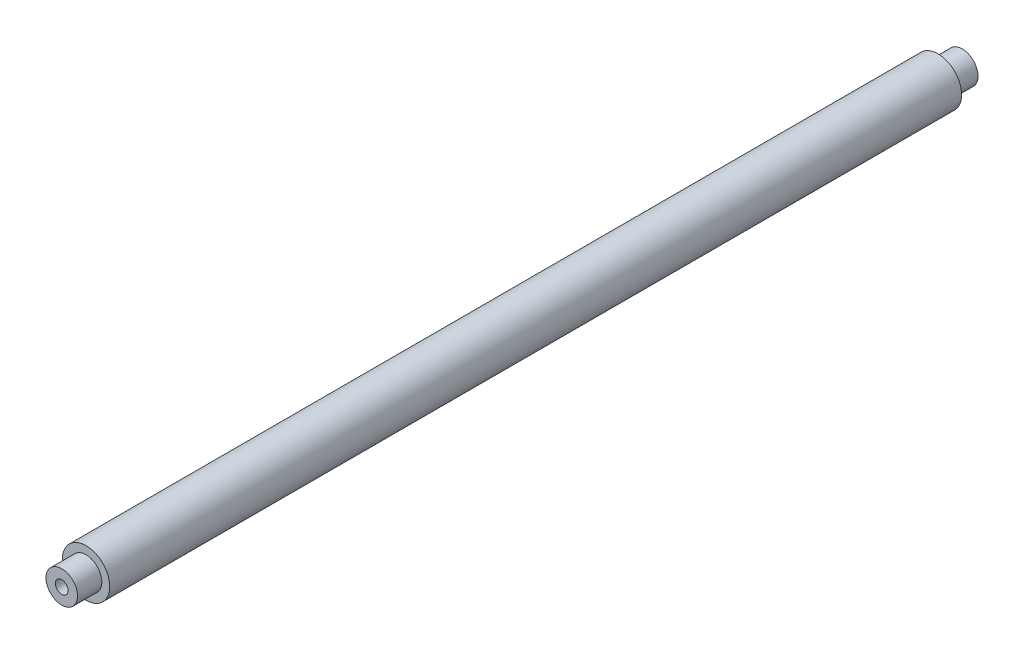
ISO-10303-21;
HEADER;
FILE_DESCRIPTION(('STEP AP214'),'2;1');
FILE_NAME('part.step','',(''),(''),'','','');
FILE_SCHEMA(('AUTOMOTIVE_DESIGN { 1 0 10303 214 1 1 1 1 }'));
ENDSEC;
DATA;
#1=APPLICATION_CONTEXT('core data for automotive mechanical design processes');
#2=APPLICATION_PROTOCOL_DEFINITION('international standard','automotive_design',2000,#1);
#3=PRODUCT_CONTEXT('',#1,'mechanical');
#4=PRODUCT('Part','Part','',(#3));
#5=PRODUCT_RELATED_PRODUCT_CATEGORY('part','',(#4));
#6=PRODUCT_DEFINITION_FORMATION('','',#4);
#7=PRODUCT_DEFINITION_CONTEXT('part definition',#1,'design');
#8=PRODUCT_DEFINITION('design','',#6,#7);
#9=PRODUCT_DEFINITION_SHAPE('','',#8);
#10=(LENGTH_UNIT() NAMED_UNIT(*) SI_UNIT(.MILLI.,.METRE.));
#11=(NAMED_UNIT(*) PLANE_ANGLE_UNIT() SI_UNIT($,.RADIAN.));
#12=(NAMED_UNIT(*) SI_UNIT($,.STERADIAN.) SOLID_ANGLE_UNIT());
#13=UNCERTAINTY_MEASURE_WITH_UNIT(LENGTH_MEASURE(1.E-05),#10,'distance_accuracy_value','');
#14=(GEOMETRIC_REPRESENTATION_CONTEXT(3) GLOBAL_UNCERTAINTY_ASSIGNED_CONTEXT((#13)) GLOBAL_UNIT_ASSIGNED_CONTEXT((#10,
#11,#12)) REPRESENTATION_CONTEXT('',''));
#15=CARTESIAN_POINT('',(0.,0.,0.));
#16=DIRECTION('',(0.,0.,1.));
#17=DIRECTION('',(1.,0.,0.));
#18=AXIS2_PLACEMENT_3D('',#15,#16,#17);
#19=CARTESIAN_POINT('',(0.,0.,342.9));
#20=DIRECTION('',(0.,0.,-1.));
#21=DIRECTION('',(-1.,0.,0.));
#22=AXIS2_PLACEMENT_3D('',#19,#20,#21);
#23=CYLINDRICAL_SURFACE('',#22,9.525);
#24=CARTESIAN_POINT('',(0.,0.,342.9));
#25=DIRECTION('',(0.,0.,1.));
#26=DIRECTION('',(1.,0.,0.));
#27=AXIS2_PLACEMENT_3D('',#24,#25,#26);
#28=CIRCLE('',#27,9.525);
#29=CARTESIAN_POINT('',(9.525,0.,342.9));
#30=VERTEX_POINT('',#29);
#31=EDGE_CURVE('E76',#30,#30,#28,.T.);
#32=ORIENTED_EDGE('',*,*,#31,.F.);
#33=EDGE_LOOP('',(#32));
#34=FACE_BOUND('',#33,.T.);
#35=CARTESIAN_POINT('',(0.,0.,0.));
#36=DIRECTION('',(0.,0.,1.));
#37=DIRECTION('',(1.,0.,0.));
#38=AXIS2_PLACEMENT_3D('',#35,#36,#37);
#39=CIRCLE('',#38,9.525);
#40=CARTESIAN_POINT('',(9.525,0.,0.));
#41=VERTEX_POINT('',#40);
#42=EDGE_CURVE('E36',#41,#41,#39,.T.);
#43=ORIENTED_EDGE('',*,*,#42,.T.);
#44=EDGE_LOOP('',(#43));
#45=FACE_BOUND('',#44,.T.);
#46=ADVANCED_FACE('F33',(#34,#45),#23,.T.);
#47=CARTESIAN_POINT('',(0.,0.,342.9));
#48=DIRECTION('',(0.,0.,1.));
#49=DIRECTION('',(1.,0.,0.));
#50=AXIS2_PLACEMENT_3D('',#47,#48,#49);
#51=PLANE('',#50);
#52=CARTESIAN_POINT('',(0.,0.,342.9));
#53=DIRECTION('',(0.,0.,1.));
#54=DIRECTION('',(1.,0.,0.));
#55=AXIS2_PLACEMENT_3D('',#52,#53,#54);
#56=CIRCLE('',#55,6.35);
#57=CARTESIAN_POINT('',(6.35,0.,342.9));
#58=VERTEX_POINT('',#57);
#59=EDGE_CURVE('E41',#58,#58,#56,.T.);
#60=ORIENTED_EDGE('',*,*,#59,.F.);
#61=EDGE_LOOP('',(#60));
#62=FACE_BOUND('',#61,.T.);
#63=ORIENTED_EDGE('',*,*,#31,.T.);
#64=EDGE_LOOP('',(#63));
#65=FACE_BOUND('',#64,.T.);
#66=ADVANCED_FACE('F87',(#62,#65),#51,.T.);
#67=CARTESIAN_POINT('',(0.,0.,0.));
#68=DIRECTION('',(0.,0.,1.));
#69=DIRECTION('',(1.,0.,0.));
#70=AXIS2_PLACEMENT_3D('',#67,#68,#69);
#71=PLANE('',#70);
#72=CARTESIAN_POINT('',(0.,0.,0.));
#73=DIRECTION('',(0.,0.,-1.));
#74=DIRECTION('',(-1.,0.,0.));
#75=AXIS2_PLACEMENT_3D('',#72,#73,#74);
#76=CIRCLE('',#75,6.35);
#77=CARTESIAN_POINT('',(-6.35,0.,0.));
#78=VERTEX_POINT('',#77);
#79=EDGE_CURVE('E11',#78,#78,#76,.T.);
#80=ORIENTED_EDGE('',*,*,#79,.F.);
#81=EDGE_LOOP('',(#80));
#82=FACE_BOUND('',#81,.T.);
#83=ORIENTED_EDGE('',*,*,#42,.F.);
#84=EDGE_LOOP('',(#83));
#85=FACE_BOUND('',#84,.T.);
#86=ADVANCED_FACE('F84',(#82,#85),#71,.F.);
#87=CARTESIAN_POINT('',(0.,0.,352.679));
#88=DIRECTION('',(0.,0.,-1.));
#89=DIRECTION('',(-1.,0.,0.));
#90=AXIS2_PLACEMENT_3D('',#87,#88,#89);
#91=CYLINDRICAL_SURFACE('',#90,6.35);
#92=CARTESIAN_POINT('',(0.,0.,352.679));
#93=DIRECTION('',(0.,0.,1.));
#94=DIRECTION('',(1.,0.,0.));
#95=AXIS2_PLACEMENT_3D('',#92,#93,#94);
#96=CIRCLE('',#95,6.35);
#97=CARTESIAN_POINT('',(6.35,0.,352.679));
#98=VERTEX_POINT('',#97);
#99=EDGE_CURVE('E72',#98,#98,#96,.T.);
#100=ORIENTED_EDGE('',*,*,#99,.F.);
#101=EDGE_LOOP('',(#100));
#102=FACE_BOUND('',#101,.T.);
#103=ORIENTED_EDGE('',*,*,#59,.T.);
#104=EDGE_LOOP('',(#103));
#105=FACE_BOUND('',#104,.T.);
#106=ADVANCED_FACE('F86',(#102,#105),#91,.T.);
#107=CARTESIAN_POINT('',(0.,0.,352.679));
#108=DIRECTION('',(0.,0.,1.));
#109=DIRECTION('',(1.,0.,0.));
#110=AXIS2_PLACEMENT_3D('',#107,#108,#109);
#111=PLANE('',#110);
#112=CARTESIAN_POINT('',(0.,0.,352.679));
#113=DIRECTION('',(0.,0.,1.));
#114=DIRECTION('',(1.,0.,0.));
#115=AXIS2_PLACEMENT_3D('',#112,#113,#114);
#116=CIRCLE('',#115,2.55269999999999);
#117=CARTESIAN_POINT('',(2.55269999999999,0.,352.679));
#118=VERTEX_POINT('',#117);
#119=EDGE_CURVE('E62',#118,#118,#116,.T.);
#120=ORIENTED_EDGE('',*,*,#119,.F.);
#121=EDGE_LOOP('',(#120));
#122=FACE_BOUND('',#121,.T.);
#123=ORIENTED_EDGE('',*,*,#99,.T.);
#124=EDGE_LOOP('',(#123));
#125=FACE_BOUND('',#124,.T.);
#126=ADVANCED_FACE('F93',(#122,#125),#111,.T.);
#127=CARTESIAN_POINT('',(0.,0.,327.279));
#128=DIRECTION('',(0.,0.,1.));
#129=DIRECTION('',(1.,0.,0.));
#130=AXIS2_PLACEMENT_3D('',#127,#128,#129);
#131=CONICAL_SURFACE('',#130,2.55269999999999,1.02974425867665);
#132=CARTESIAN_POINT('',(0.,0.,325.745183097808));
#133=VERTEX_POINT('',#132);
#134=VERTEX_LOOP('',#133);
#135=FACE_BOUND('',#134,.T.);
#136=CARTESIAN_POINT('',(0.,0.,327.279));
#137=DIRECTION('',(0.,0.,1.));
#138=DIRECTION('',(1.,0.,0.));
#139=AXIS2_PLACEMENT_3D('',#136,#137,#138);
#140=CIRCLE('',#139,2.55269999999999);
#141=CARTESIAN_POINT('',(2.55269999999999,0.,327.279));
#142=VERTEX_POINT('',#141);
#143=EDGE_CURVE('E69',#142,#142,#140,.T.);
#144=ORIENTED_EDGE('',*,*,#143,.T.);
#145=EDGE_LOOP('',(#144));
#146=FACE_BOUND('',#145,.T.);
#147=ADVANCED_FACE('F123',(#135,#146),#131,.F.);
#148=CARTESIAN_POINT('',(0.,0.,352.679));
#149=DIRECTION('',(0.,0.,1.));
#150=DIRECTION('',(1.,0.,0.));
#151=AXIS2_PLACEMENT_3D('',#148,#149,#150);
#152=CYLINDRICAL_SURFACE('',#151,2.55269999999999);
#153=ORIENTED_EDGE('',*,*,#143,.F.);
#154=EDGE_LOOP('',(#153));
#155=FACE_BOUND('',#154,.T.);
#156=ORIENTED_EDGE('',*,*,#119,.T.);
#157=EDGE_LOOP('',(#156));
#158=FACE_BOUND('',#157,.T.);
#159=ADVANCED_FACE('F133',(#155,#158),#152,.F.);
#160=CARTESIAN_POINT('',(0.,0.,-9.779));
#161=DIRECTION('',(0.,0.,1.));
#162=DIRECTION('',(1.,0.,0.));
#163=AXIS2_PLACEMENT_3D('',#160,#161,#162);
#164=CYLINDRICAL_SURFACE('',#163,6.35);
#165=CARTESIAN_POINT('',(0.,0.,-9.779));
#166=DIRECTION('',(0.,0.,-1.));
#167=DIRECTION('',(-1.,0.,0.));
#168=AXIS2_PLACEMENT_3D('',#165,#166,#167);
#169=CIRCLE('',#168,6.35);
#170=CARTESIAN_POINT('',(-6.35,0.,-9.779));
#171=VERTEX_POINT('',#170);
#172=EDGE_CURVE('E58',#171,#171,#169,.T.);
#173=ORIENTED_EDGE('',*,*,#172,.F.);
#174=EDGE_LOOP('',(#173));
#175=FACE_BOUND('',#174,.T.);
#176=ORIENTED_EDGE('',*,*,#79,.T.);
#177=EDGE_LOOP('',(#176));
#178=FACE_BOUND('',#177,.T.);
#179=ADVANCED_FACE('F141',(#175,#178),#164,.T.);
#180=CARTESIAN_POINT('',(0.,0.,-9.779));
#181=DIRECTION('',(0.,0.,-1.));
#182=DIRECTION('',(-1.,0.,0.));
#183=AXIS2_PLACEMENT_3D('',#180,#181,#182);
#184=PLANE('',#183);
#185=CARTESIAN_POINT('',(0.,0.,-9.779));
#186=DIRECTION('',(0.,0.,-1.));
#187=DIRECTION('',(-1.,0.,0.));
#188=AXIS2_PLACEMENT_3D('',#185,#186,#187);
#189=CIRCLE('',#188,2.55269999999999);
#190=CARTESIAN_POINT('',(-2.55269999999999,0.,-9.779));
#191=VERTEX_POINT('',#190);
#192=EDGE_CURVE('E59',#191,#191,#189,.T.);
#193=ORIENTED_EDGE('',*,*,#192,.F.);
#194=EDGE_LOOP('',(#193));
#195=FACE_BOUND('',#194,.T.);
#196=ORIENTED_EDGE('',*,*,#172,.T.);
#197=EDGE_LOOP('',(#196));
#198=FACE_BOUND('',#197,.T.);
#199=ADVANCED_FACE('F52',(#195,#198),#184,.T.);
#200=CARTESIAN_POINT('',(0.,0.,15.621));
#201=DIRECTION('',(0.,0.,-1.));
#202=DIRECTION('',(-1.,0.,0.));
#203=AXIS2_PLACEMENT_3D('',#200,#201,#202);
#204=CONICAL_SURFACE('',#203,2.55269999999999,1.02974425867665);
#205=CARTESIAN_POINT('',(0.,0.,17.1548169021917));
#206=VERTEX_POINT('',#205);
#207=VERTEX_LOOP('',#206);
#208=FACE_BOUND('',#207,.T.);
#209=CARTESIAN_POINT('',(0.,0.,15.621));
#210=DIRECTION('',(0.,0.,-1.));
#211=DIRECTION('',(-1.,0.,0.));
#212=AXIS2_PLACEMENT_3D('',#209,#210,#211);
#213=CIRCLE('',#212,2.55269999999999);
#214=CARTESIAN_POINT('',(-2.55269999999999,0.,15.621));
#215=VERTEX_POINT('',#214);
#216=EDGE_CURVE('E56',#215,#215,#213,.T.);
#217=ORIENTED_EDGE('',*,*,#216,.T.);
#218=EDGE_LOOP('',(#217));
#219=FACE_BOUND('',#218,.T.);
#220=ADVANCED_FACE('F48',(#208,#219),#204,.F.);
#221=CARTESIAN_POINT('',(0.,0.,-9.779));
#222=DIRECTION('',(0.,0.,-1.));
#223=DIRECTION('',(-1.,0.,0.));
#224=AXIS2_PLACEMENT_3D('',#221,#222,#223);
#225=CYLINDRICAL_SURFACE('',#224,2.55269999999999);
#226=ORIENTED_EDGE('',*,*,#216,.F.);
#227=EDGE_LOOP('',(#226));
#228=FACE_BOUND('',#227,.T.);
#229=ORIENTED_EDGE('',*,*,#192,.T.);
#230=EDGE_LOOP('',(#229));
#231=FACE_BOUND('',#230,.T.);
#232=ADVANCED_FACE('F51',(#228,#231),#225,.F.);
#233=CLOSED_SHELL('',(#46,#66,#86,#106,#126,#147,#159,#179,#199,#220,#232));
#234=MANIFOLD_SOLID_BREP('B2',#233);
#235=ADVANCED_BREP_SHAPE_REPRESENTATION('',(#18,#234),#14);
#236=SHAPE_DEFINITION_REPRESENTATION(#9,#235);
ENDSEC;
END-ISO-10303-21;
